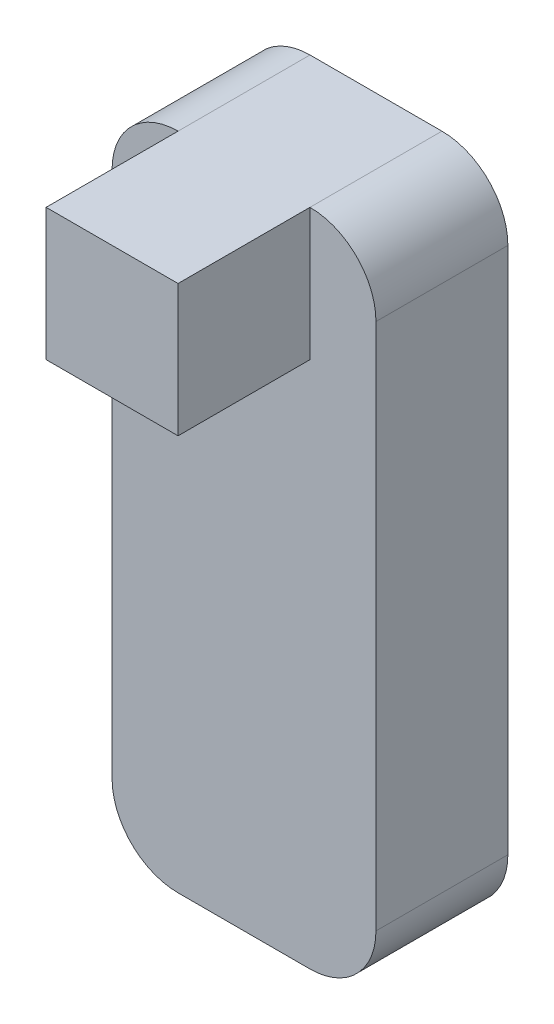
ISO-10303-21;
HEADER;
FILE_DESCRIPTION(('STEP AP214'),'2;1');
FILE_NAME('part.step','',(''),(''),'','','');
FILE_SCHEMA(('AUTOMOTIVE_DESIGN { 1 0 10303 214 1 1 1 1 }'));
ENDSEC;
DATA;
#1=APPLICATION_CONTEXT('core data for automotive mechanical design processes');
#2=APPLICATION_PROTOCOL_DEFINITION('international standard','automotive_design',2000,#1);
#3=PRODUCT_CONTEXT('',#1,'mechanical');
#4=PRODUCT('Part','Part','',(#3));
#5=PRODUCT_RELATED_PRODUCT_CATEGORY('part','',(#4));
#6=PRODUCT_DEFINITION_FORMATION('','',#4);
#7=PRODUCT_DEFINITION_CONTEXT('part definition',#1,'design');
#8=PRODUCT_DEFINITION('design','',#6,#7);
#9=PRODUCT_DEFINITION_SHAPE('','',#8);
#10=(LENGTH_UNIT() NAMED_UNIT(*) SI_UNIT(.MILLI.,.METRE.));
#11=(NAMED_UNIT(*) PLANE_ANGLE_UNIT() SI_UNIT($,.RADIAN.));
#12=(NAMED_UNIT(*) SI_UNIT($,.STERADIAN.) SOLID_ANGLE_UNIT());
#13=UNCERTAINTY_MEASURE_WITH_UNIT(LENGTH_MEASURE(1.E-05),#10,'distance_accuracy_value','');
#14=(GEOMETRIC_REPRESENTATION_CONTEXT(3) GLOBAL_UNCERTAINTY_ASSIGNED_CONTEXT((#13)) GLOBAL_UNIT_ASSIGNED_CONTEXT((#10,
#11,#12)) REPRESENTATION_CONTEXT('',''));
#15=CARTESIAN_POINT('',(0.,0.,0.));
#16=DIRECTION('',(0.,0.,1.));
#17=DIRECTION('',(1.,0.,0.));
#18=AXIS2_PLACEMENT_3D('',#15,#16,#17);
#19=CARTESIAN_POINT('',(30.,10.,20.));
#20=DIRECTION('',(0.,0.,-1.));
#21=DIRECTION('',(-1.,0.,0.));
#22=AXIS2_PLACEMENT_3D('',#19,#20,#21);
#23=CYLINDRICAL_SURFACE('',#22,10.);
#24=CARTESIAN_POINT('',(30.,10.,0.));
#25=DIRECTION('',(0.,0.,1.));
#26=DIRECTION('',(1.,0.,0.));
#27=AXIS2_PLACEMENT_3D('',#24,#25,#26);
#28=CIRCLE('',#27,10.);
#29=CARTESIAN_POINT('',(29.9999999999999,0.,0.));
#30=VERTEX_POINT('',#29);
#31=CARTESIAN_POINT('',(40.,10.0000000000001,0.));
#32=VERTEX_POINT('',#31);
#33=EDGE_CURVE('E153',#30,#32,#28,.T.);
#34=ORIENTED_EDGE('',*,*,#33,.T.);
#35=DIRECTION('',(0.,0.,-1.));
#36=VECTOR('',#35,1.);
#37=CARTESIAN_POINT('',(40.,10.0000000000001,20.));
#38=LINE('',#37,#36);
#39=CARTESIAN_POINT('',(40.,10.0000000000001,20.));
#40=VERTEX_POINT('',#39);
#41=EDGE_CURVE('E12',#40,#32,#38,.T.);
#42=ORIENTED_EDGE('',*,*,#41,.F.);
#43=CARTESIAN_POINT('',(30.,10.,20.));
#44=DIRECTION('',(0.,0.,1.));
#45=DIRECTION('',(1.,0.,0.));
#46=AXIS2_PLACEMENT_3D('',#43,#44,#45);
#47=CIRCLE('',#46,10.);
#48=CARTESIAN_POINT('',(29.9999999999999,0.,20.));
#49=VERTEX_POINT('',#48);
#50=EDGE_CURVE('E180',#49,#40,#47,.T.);
#51=ORIENTED_EDGE('',*,*,#50,.F.);
#52=DIRECTION('',(0.,0.,-1.));
#53=VECTOR('',#52,1.);
#54=CARTESIAN_POINT('',(29.9999999999999,0.,20.));
#55=LINE('',#54,#53);
#56=EDGE_CURVE('E149',#49,#30,#55,.T.);
#57=ORIENTED_EDGE('',*,*,#56,.T.);
#58=EDGE_LOOP('',(#34,#42,#51,#57));
#59=FACE_BOUND('',#58,.T.);
#60=ADVANCED_FACE('F42',(#59),#23,.T.);
#61=CARTESIAN_POINT('',(40.,0.,20.));
#62=DIRECTION('',(-1.,0.,0.));
#63=DIRECTION('',(0.,-1.,0.));
#64=AXIS2_PLACEMENT_3D('',#61,#62,#63);
#65=PLANE('',#64);
#66=DIRECTION('',(0.,1.,0.));
#67=VECTOR('',#66,1.);
#68=CARTESIAN_POINT('',(40.,0.,0.));
#69=LINE('',#68,#67);
#70=CARTESIAN_POINT('',(40.,90.,0.));
#71=VERTEX_POINT('',#70);
#72=EDGE_CURVE('E157',#32,#71,#69,.T.);
#73=ORIENTED_EDGE('',*,*,#72,.T.);
#74=DIRECTION('',(0.,0.,-1.));
#75=VECTOR('',#74,1.);
#76=CARTESIAN_POINT('',(40.,90.,20.));
#77=LINE('',#76,#75);
#78=CARTESIAN_POINT('',(40.,90.,20.));
#79=VERTEX_POINT('',#78);
#80=EDGE_CURVE('E50',#79,#71,#77,.T.);
#81=ORIENTED_EDGE('',*,*,#80,.F.);
#82=DIRECTION('',(0.,1.,0.));
#83=VECTOR('',#82,1.);
#84=CARTESIAN_POINT('',(40.,0.,20.));
#85=LINE('',#84,#83);
#86=EDGE_CURVE('E107',#40,#79,#85,.T.);
#87=ORIENTED_EDGE('',*,*,#86,.F.);
#88=ORIENTED_EDGE('',*,*,#41,.T.);
#89=EDGE_LOOP('',(#73,#81,#87,#88));
#90=FACE_BOUND('',#89,.T.);
#91=ADVANCED_FACE('F273',(#90),#65,.F.);
#92=CARTESIAN_POINT('',(30.,90.,20.));
#93=DIRECTION('',(0.,0.,-1.));
#94=DIRECTION('',(-1.,0.,0.));
#95=AXIS2_PLACEMENT_3D('',#92,#93,#94);
#96=CYLINDRICAL_SURFACE('',#95,9.99999999999999);
#97=CARTESIAN_POINT('',(30.,90.,0.));
#98=DIRECTION('',(0.,0.,1.));
#99=DIRECTION('',(1.,0.,0.));
#100=AXIS2_PLACEMENT_3D('',#97,#98,#99);
#101=CIRCLE('',#100,9.99999999999999);
#102=CARTESIAN_POINT('',(30.,100.,0.));
#103=VERTEX_POINT('',#102);
#104=EDGE_CURVE('E161',#71,#103,#101,.T.);
#105=ORIENTED_EDGE('',*,*,#104,.T.);
#106=DIRECTION('',(0.,0.,-1.));
#107=VECTOR('',#106,1.);
#108=CARTESIAN_POINT('',(30.,100.,20.));
#109=LINE('',#108,#107);
#110=CARTESIAN_POINT('',(30.,100.,20.));
#111=VERTEX_POINT('',#110);
#112=EDGE_CURVE('E190',#111,#103,#109,.T.);
#113=ORIENTED_EDGE('',*,*,#112,.F.);
#114=CARTESIAN_POINT('',(30.,90.,20.));
#115=DIRECTION('',(0.,0.,1.));
#116=DIRECTION('',(1.,0.,0.));
#117=AXIS2_PLACEMENT_3D('',#114,#115,#116);
#118=CIRCLE('',#117,9.99999999999999);
#119=EDGE_CURVE('E200',#79,#111,#118,.T.);
#120=ORIENTED_EDGE('',*,*,#119,.F.);
#121=ORIENTED_EDGE('',*,*,#80,.T.);
#122=EDGE_LOOP('',(#105,#113,#120,#121));
#123=FACE_BOUND('',#122,.T.);
#124=ADVANCED_FACE('F197',(#123),#96,.T.);
#125=CARTESIAN_POINT('',(0.,100.,20.));
#126=DIRECTION('',(0.,1.,0.));
#127=DIRECTION('',(0.,0.,1.));
#128=AXIS2_PLACEMENT_3D('',#125,#126,#127);
#129=PLANE('',#128);
#130=DIRECTION('',(1.,0.,0.));
#131=VECTOR('',#130,1.);
#132=CARTESIAN_POINT('',(0.,100.,0.));
#133=LINE('',#132,#131);
#134=CARTESIAN_POINT('',(10.,100.,0.));
#135=VERTEX_POINT('',#134);
#136=EDGE_CURVE('E165',#135,#103,#133,.T.);
#137=ORIENTED_EDGE('',*,*,#136,.F.);
#138=DIRECTION('',(0.,0.,-1.));
#139=VECTOR('',#138,1.);
#140=CARTESIAN_POINT('',(10.,100.,20.));
#141=LINE('',#140,#139);
#142=CARTESIAN_POINT('',(10.,100.,20.));
#143=VERTEX_POINT('',#142);
#144=EDGE_CURVE('E187',#143,#135,#141,.T.);
#145=ORIENTED_EDGE('',*,*,#144,.F.);
#146=DIRECTION('',(0.,0.,1.));
#147=VECTOR('',#146,1.);
#148=CARTESIAN_POINT('',(10.,100.,20.));
#149=LINE('',#148,#147);
#150=CARTESIAN_POINT('',(10.0000000000001,100.,40.));
#151=VERTEX_POINT('',#150);
#152=EDGE_CURVE('E349',#143,#151,#149,.T.);
#153=ORIENTED_EDGE('',*,*,#152,.T.);
#154=DIRECTION('',(1.,0.,0.));
#155=VECTOR('',#154,1.);
#156=CARTESIAN_POINT('',(30.0000000000001,100.,40.));
#157=LINE('',#156,#155);
#158=CARTESIAN_POINT('',(30.0000000000001,100.,40.));
#159=VERTEX_POINT('',#158);
#160=EDGE_CURVE('E332',#151,#159,#157,.T.);
#161=ORIENTED_EDGE('',*,*,#160,.T.);
#162=DIRECTION('',(0.,0.,-1.));
#163=VECTOR('',#162,1.);
#164=CARTESIAN_POINT('',(30.,100.,20.));
#165=LINE('',#164,#163);
#166=EDGE_CURVE('E214',#159,#111,#165,.T.);
#167=ORIENTED_EDGE('',*,*,#166,.T.);
#168=ORIENTED_EDGE('',*,*,#112,.T.);
#169=EDGE_LOOP('',(#137,#145,#153,#161,#167,#168));
#170=FACE_BOUND('',#169,.T.);
#171=ADVANCED_FACE('F208',(#170),#129,.T.);
#172=CARTESIAN_POINT('',(10.,90.,20.));
#173=DIRECTION('',(0.,0.,-1.));
#174=DIRECTION('',(-1.,0.,0.));
#175=AXIS2_PLACEMENT_3D('',#172,#173,#174);
#176=CYLINDRICAL_SURFACE('',#175,9.99999999999999);
#177=CARTESIAN_POINT('',(10.,90.,0.));
#178=DIRECTION('',(0.,0.,1.));
#179=DIRECTION('',(1.,0.,0.));
#180=AXIS2_PLACEMENT_3D('',#177,#178,#179);
#181=CIRCLE('',#180,9.99999999999999);
#182=CARTESIAN_POINT('',(0.,90.,0.));
#183=VERTEX_POINT('',#182);
#184=EDGE_CURVE('E169',#135,#183,#181,.T.);
#185=ORIENTED_EDGE('',*,*,#184,.T.);
#186=DIRECTION('',(0.,0.,-1.));
#187=VECTOR('',#186,1.);
#188=CARTESIAN_POINT('',(0.,90.,20.));
#189=LINE('',#188,#187);
#190=CARTESIAN_POINT('',(0.,90.,20.));
#191=VERTEX_POINT('',#190);
#192=EDGE_CURVE('E133',#191,#183,#189,.T.);
#193=ORIENTED_EDGE('',*,*,#192,.F.);
#194=CARTESIAN_POINT('',(10.,90.,20.));
#195=DIRECTION('',(0.,0.,1.));
#196=DIRECTION('',(1.,0.,0.));
#197=AXIS2_PLACEMENT_3D('',#194,#195,#196);
#198=CIRCLE('',#197,9.99999999999999);
#199=EDGE_CURVE('E141',#143,#191,#198,.T.);
#200=ORIENTED_EDGE('',*,*,#199,.F.);
#201=ORIENTED_EDGE('',*,*,#144,.T.);
#202=EDGE_LOOP('',(#185,#193,#200,#201));
#203=FACE_BOUND('',#202,.T.);
#204=ADVANCED_FACE('F283',(#203),#176,.T.);
#205=CARTESIAN_POINT('',(0.,0.,20.));
#206=DIRECTION('',(-1.,0.,0.));
#207=DIRECTION('',(0.,0.,1.));
#208=AXIS2_PLACEMENT_3D('',#205,#206,#207);
#209=PLANE('',#208);
#210=DIRECTION('',(0.,1.,0.));
#211=VECTOR('',#210,1.);
#212=CARTESIAN_POINT('',(0.,0.,0.));
#213=LINE('',#212,#211);
#214=CARTESIAN_POINT('',(0.,10.0000000000001,0.));
#215=VERTEX_POINT('',#214);
#216=EDGE_CURVE('E127',#215,#183,#213,.T.);
#217=ORIENTED_EDGE('',*,*,#216,.F.);
#218=DIRECTION('',(0.,0.,-1.));
#219=VECTOR('',#218,1.);
#220=CARTESIAN_POINT('',(0.,10.0000000000001,20.));
#221=LINE('',#220,#219);
#222=CARTESIAN_POINT('',(0.,10.0000000000001,20.));
#223=VERTEX_POINT('',#222);
#224=EDGE_CURVE('E122',#223,#215,#221,.T.);
#225=ORIENTED_EDGE('',*,*,#224,.F.);
#226=DIRECTION('',(0.,1.,0.));
#227=VECTOR('',#226,1.);
#228=CARTESIAN_POINT('',(0.,0.,20.));
#229=LINE('',#228,#227);
#230=EDGE_CURVE('E125',#223,#191,#229,.T.);
#231=ORIENTED_EDGE('',*,*,#230,.T.);
#232=ORIENTED_EDGE('',*,*,#192,.T.);
#233=EDGE_LOOP('',(#217,#225,#231,#232));
#234=FACE_BOUND('',#233,.T.);
#235=ADVANCED_FACE('F124',(#234),#209,.T.);
#236=CARTESIAN_POINT('',(10.,10.,20.));
#237=DIRECTION('',(0.,0.,-1.));
#238=DIRECTION('',(-1.,0.,0.));
#239=AXIS2_PLACEMENT_3D('',#236,#237,#238);
#240=CYLINDRICAL_SURFACE('',#239,10.);
#241=CARTESIAN_POINT('',(10.,10.,0.));
#242=DIRECTION('',(0.,0.,1.));
#243=DIRECTION('',(1.,0.,0.));
#244=AXIS2_PLACEMENT_3D('',#241,#242,#243);
#245=CIRCLE('',#244,10.);
#246=CARTESIAN_POINT('',(10.0000000000001,0.,0.));
#247=VERTEX_POINT('',#246);
#248=EDGE_CURVE('E175',#247,#215,#245,.F.);
#249=ORIENTED_EDGE('',*,*,#248,.F.);
#250=DIRECTION('',(0.,0.,-1.));
#251=VECTOR('',#250,1.);
#252=CARTESIAN_POINT('',(10.0000000000001,0.,20.));
#253=LINE('',#252,#251);
#254=CARTESIAN_POINT('',(10.0000000000001,0.,20.));
#255=VERTEX_POINT('',#254);
#256=EDGE_CURVE('E134',#255,#247,#253,.T.);
#257=ORIENTED_EDGE('',*,*,#256,.F.);
#258=CARTESIAN_POINT('',(10.,10.,20.));
#259=DIRECTION('',(0.,0.,1.));
#260=DIRECTION('',(1.,0.,0.));
#261=AXIS2_PLACEMENT_3D('',#258,#259,#260);
#262=CIRCLE('',#261,10.);
#263=EDGE_CURVE('E138',#255,#223,#262,.F.);
#264=ORIENTED_EDGE('',*,*,#263,.T.);
#265=ORIENTED_EDGE('',*,*,#224,.T.);
#266=EDGE_LOOP('',(#249,#257,#264,#265));
#267=FACE_BOUND('',#266,.T.);
#268=ADVANCED_FACE('F145',(#267),#240,.T.);
#269=CARTESIAN_POINT('',(0.,0.,20.));
#270=DIRECTION('',(0.,1.,0.));
#271=DIRECTION('',(0.,0.,1.));
#272=AXIS2_PLACEMENT_3D('',#269,#270,#271);
#273=PLANE('',#272);
#274=DIRECTION('',(1.,0.,0.));
#275=VECTOR('',#274,1.);
#276=CARTESIAN_POINT('',(0.,0.,0.));
#277=LINE('',#276,#275);
#278=EDGE_CURVE('E99',#247,#30,#277,.T.);
#279=ORIENTED_EDGE('',*,*,#278,.T.);
#280=ORIENTED_EDGE('',*,*,#56,.F.);
#281=DIRECTION('',(1.,0.,0.));
#282=VECTOR('',#281,1.);
#283=CARTESIAN_POINT('',(0.,0.,20.));
#284=LINE('',#283,#282);
#285=EDGE_CURVE('E66',#255,#49,#284,.T.);
#286=ORIENTED_EDGE('',*,*,#285,.F.);
#287=ORIENTED_EDGE('',*,*,#256,.T.);
#288=EDGE_LOOP('',(#279,#280,#286,#287));
#289=FACE_BOUND('',#288,.T.);
#290=ADVANCED_FACE('F291',(#289),#273,.F.);
#291=CARTESIAN_POINT('',(0.,0.,20.));
#292=DIRECTION('',(0.,0.,1.));
#293=DIRECTION('',(1.,0.,0.));
#294=AXIS2_PLACEMENT_3D('',#291,#292,#293);
#295=PLANE('',#294);
#296=DIRECTION('',(0.,1.,0.));
#297=VECTOR('',#296,1.);
#298=CARTESIAN_POINT('',(30.0000000000001,80.,20.));
#299=LINE('',#298,#297);
#300=CARTESIAN_POINT('',(30.0000000000001,80.,20.));
#301=VERTEX_POINT('',#300);
#302=EDGE_CURVE('E220',#301,#111,#299,.T.);
#303=ORIENTED_EDGE('',*,*,#302,.F.);
#304=DIRECTION('',(-1.,0.,0.));
#305=VECTOR('',#304,1.);
#306=CARTESIAN_POINT('',(30.0000000000001,80.,20.));
#307=LINE('',#306,#305);
#308=CARTESIAN_POINT('',(10.0000000000001,80.,20.));
#309=VERTEX_POINT('',#308);
#310=EDGE_CURVE('E329',#301,#309,#307,.T.);
#311=ORIENTED_EDGE('',*,*,#310,.T.);
#312=DIRECTION('',(0.,1.,0.));
#313=VECTOR('',#312,1.);
#314=CARTESIAN_POINT('',(10.0000000000001,80.,20.));
#315=LINE('',#314,#313);
#316=EDGE_CURVE('E343',#309,#143,#315,.T.);
#317=ORIENTED_EDGE('',*,*,#316,.T.);
#318=ORIENTED_EDGE('',*,*,#199,.T.);
#319=ORIENTED_EDGE('',*,*,#230,.F.);
#320=ORIENTED_EDGE('',*,*,#263,.F.);
#321=ORIENTED_EDGE('',*,*,#285,.T.);
#322=ORIENTED_EDGE('',*,*,#50,.T.);
#323=ORIENTED_EDGE('',*,*,#86,.T.);
#324=ORIENTED_EDGE('',*,*,#119,.T.);
#325=EDGE_LOOP('',(#303,#311,#317,#318,#319,#320,#321,#322,#323,#324));
#326=FACE_BOUND('',#325,.T.);
#327=ADVANCED_FACE('F137',(#326),#295,.T.);
#328=CARTESIAN_POINT('',(0.,0.,0.));
#329=DIRECTION('',(0.,0.,1.));
#330=DIRECTION('',(1.,0.,0.));
#331=AXIS2_PLACEMENT_3D('',#328,#329,#330);
#332=PLANE('',#331);
#333=CARTESIAN_POINT('',(20.,10.0000000000001,0.));
#334=DIRECTION('',(0.,0.,-1.));
#335=DIRECTION('',(-1.,0.,0.));
#336=AXIS2_PLACEMENT_3D('',#333,#334,#335);
#337=CIRCLE('',#336,2.5);
#338=CARTESIAN_POINT('',(18.,8.50000000000007,0.));
#339=VERTEX_POINT('',#338);
#340=CARTESIAN_POINT('',(22.,8.50000000000007,0.));
#341=VERTEX_POINT('',#340);
#342=EDGE_CURVE('E241',#339,#341,#337,.T.);
#343=ORIENTED_EDGE('',*,*,#342,.F.);
#344=DIRECTION('',(-1.,0.,0.));
#345=VECTOR('',#344,1.);
#346=CARTESIAN_POINT('',(0.,8.50000000000007,0.));
#347=LINE('',#346,#345);
#348=EDGE_CURVE('E57',#341,#339,#347,.T.);
#349=ORIENTED_EDGE('',*,*,#348,.F.);
#350=EDGE_LOOP('',(#343,#349));
#351=FACE_BOUND('',#350,.T.);
#352=ORIENTED_EDGE('',*,*,#33,.F.);
#353=ORIENTED_EDGE('',*,*,#278,.F.);
#354=ORIENTED_EDGE('',*,*,#248,.T.);
#355=ORIENTED_EDGE('',*,*,#216,.T.);
#356=ORIENTED_EDGE('',*,*,#184,.F.);
#357=ORIENTED_EDGE('',*,*,#136,.T.);
#358=ORIENTED_EDGE('',*,*,#104,.F.);
#359=ORIENTED_EDGE('',*,*,#72,.F.);
#360=EDGE_LOOP('',(#352,#353,#354,#355,#356,#357,#358,#359));
#361=FACE_BOUND('',#360,.T.);
#362=ADVANCED_FACE('F203',(#351,#361),#332,.F.);
#363=CARTESIAN_POINT('',(0.,8.50000000000007,8.));
#364=DIRECTION('',(0.,-1.,0.));
#365=DIRECTION('',(0.,0.,-1.));
#366=AXIS2_PLACEMENT_3D('',#363,#364,#365);
#367=PLANE('',#366);
#368=ORIENTED_EDGE('',*,*,#348,.T.);
#369=DIRECTION('',(0.,0.,-1.));
#370=VECTOR('',#369,1.);
#371=CARTESIAN_POINT('',(18.,8.50000000000007,8.));
#372=LINE('',#371,#370);
#373=CARTESIAN_POINT('',(18.,8.50000000000007,8.));
#374=VERTEX_POINT('',#373);
#375=EDGE_CURVE('E243',#374,#339,#372,.T.);
#376=ORIENTED_EDGE('',*,*,#375,.F.);
#377=DIRECTION('',(-1.,0.,0.));
#378=VECTOR('',#377,1.);
#379=CARTESIAN_POINT('',(0.,8.50000000000007,8.));
#380=LINE('',#379,#378);
#381=CARTESIAN_POINT('',(22.,8.50000000000007,8.));
#382=VERTEX_POINT('',#381);
#383=EDGE_CURVE('E246',#382,#374,#380,.T.);
#384=ORIENTED_EDGE('',*,*,#383,.F.);
#385=DIRECTION('',(0.,0.,-1.));
#386=VECTOR('',#385,1.);
#387=CARTESIAN_POINT('',(22.,8.50000000000007,8.));
#388=LINE('',#387,#386);
#389=EDGE_CURVE('E158',#382,#341,#388,.T.);
#390=ORIENTED_EDGE('',*,*,#389,.T.);
#391=EDGE_LOOP('',(#368,#376,#384,#390));
#392=FACE_BOUND('',#391,.T.);
#393=ADVANCED_FACE('F247',(#392),#367,.F.);
#394=CARTESIAN_POINT('',(20.,10.0000000000001,8.));
#395=DIRECTION('',(0.,0.,-1.));
#396=DIRECTION('',(-1.,0.,0.));
#397=AXIS2_PLACEMENT_3D('',#394,#395,#396);
#398=CYLINDRICAL_SURFACE('',#397,2.5);
#399=ORIENTED_EDGE('',*,*,#342,.T.);
#400=ORIENTED_EDGE('',*,*,#389,.F.);
#401=CARTESIAN_POINT('',(20.,10.0000000000001,8.));
#402=DIRECTION('',(0.,0.,-1.));
#403=DIRECTION('',(-1.,0.,0.));
#404=AXIS2_PLACEMENT_3D('',#401,#402,#403);
#405=CIRCLE('',#404,2.5);
#406=EDGE_CURVE('E239',#374,#382,#405,.T.);
#407=ORIENTED_EDGE('',*,*,#406,.F.);
#408=ORIENTED_EDGE('',*,*,#375,.T.);
#409=EDGE_LOOP('',(#399,#400,#407,#408));
#410=FACE_BOUND('',#409,.T.);
#411=ADVANCED_FACE('F237',(#410),#398,.F.);
#412=CARTESIAN_POINT('',(0.,0.,8.));
#413=DIRECTION('',(0.,0.,-1.));
#414=DIRECTION('',(-1.,0.,0.));
#415=AXIS2_PLACEMENT_3D('',#412,#413,#414);
#416=PLANE('',#415);
#417=ORIENTED_EDGE('',*,*,#383,.T.);
#418=ORIENTED_EDGE('',*,*,#406,.T.);
#419=EDGE_LOOP('',(#417,#418));
#420=FACE_BOUND('',#419,.T.);
#421=ADVANCED_FACE('F251',(#420),#416,.T.);
#422=CARTESIAN_POINT('',(30.0000000000001,80.,20.));
#423=DIRECTION('',(1.,0.,0.));
#424=DIRECTION('',(0.,1.,0.));
#425=AXIS2_PLACEMENT_3D('',#422,#423,#424);
#426=PLANE('',#425);
#427=ORIENTED_EDGE('',*,*,#166,.F.);
#428=DIRECTION('',(0.,1.,0.));
#429=VECTOR('',#428,1.);
#430=CARTESIAN_POINT('',(30.0000000000001,80.,40.));
#431=LINE('',#430,#429);
#432=CARTESIAN_POINT('',(30.0000000000001,80.,40.));
#433=VERTEX_POINT('',#432);
#434=EDGE_CURVE('E260',#433,#159,#431,.T.);
#435=ORIENTED_EDGE('',*,*,#434,.F.);
#436=DIRECTION('',(0.,0.,-1.));
#437=VECTOR('',#436,1.);
#438=CARTESIAN_POINT('',(30.0000000000001,80.,20.));
#439=LINE('',#438,#437);
#440=EDGE_CURVE('E324',#433,#301,#439,.T.);
#441=ORIENTED_EDGE('',*,*,#440,.T.);
#442=ORIENTED_EDGE('',*,*,#302,.T.);
#443=EDGE_LOOP('',(#427,#435,#441,#442));
#444=FACE_BOUND('',#443,.T.);
#445=ADVANCED_FACE('F305',(#444),#426,.T.);
#446=CARTESIAN_POINT('',(30.0000000000001,80.,40.));
#447=DIRECTION('',(0.,0.,1.));
#448=DIRECTION('',(1.,0.,0.));
#449=AXIS2_PLACEMENT_3D('',#446,#447,#448);
#450=PLANE('',#449);
#451=ORIENTED_EDGE('',*,*,#160,.F.);
#452=DIRECTION('',(0.,1.,0.));
#453=VECTOR('',#452,1.);
#454=CARTESIAN_POINT('',(10.0000000000001,80.,40.));
#455=LINE('',#454,#453);
#456=CARTESIAN_POINT('',(10.0000000000001,80.,40.));
#457=VERTEX_POINT('',#456);
#458=EDGE_CURVE('E336',#457,#151,#455,.T.);
#459=ORIENTED_EDGE('',*,*,#458,.F.);
#460=DIRECTION('',(1.,0.,0.));
#461=VECTOR('',#460,1.);
#462=CARTESIAN_POINT('',(30.0000000000001,80.,40.));
#463=LINE('',#462,#461);
#464=EDGE_CURVE('E328',#457,#433,#463,.T.);
#465=ORIENTED_EDGE('',*,*,#464,.T.);
#466=ORIENTED_EDGE('',*,*,#434,.T.);
#467=EDGE_LOOP('',(#451,#459,#465,#466));
#468=FACE_BOUND('',#467,.T.);
#469=ADVANCED_FACE('F308',(#468),#450,.T.);
#470=CARTESIAN_POINT('',(10.0000000000001,80.,20.));
#471=DIRECTION('',(-1.,0.,0.));
#472=DIRECTION('',(0.,-1.,0.));
#473=AXIS2_PLACEMENT_3D('',#470,#471,#472);
#474=PLANE('',#473);
#475=ORIENTED_EDGE('',*,*,#152,.F.);
#476=ORIENTED_EDGE('',*,*,#316,.F.);
#477=DIRECTION('',(0.,0.,1.));
#478=VECTOR('',#477,1.);
#479=CARTESIAN_POINT('',(10.0000000000001,80.,20.));
#480=LINE('',#479,#478);
#481=EDGE_CURVE('E339',#309,#457,#480,.T.);
#482=ORIENTED_EDGE('',*,*,#481,.T.);
#483=ORIENTED_EDGE('',*,*,#458,.T.);
#484=EDGE_LOOP('',(#475,#476,#482,#483));
#485=FACE_BOUND('',#484,.T.);
#486=ADVANCED_FACE('F309',(#485),#474,.T.);
#487=CARTESIAN_POINT('',(0.,80.,0.));
#488=DIRECTION('',(0.,-1.,0.));
#489=DIRECTION('',(1.,0.,0.));
#490=AXIS2_PLACEMENT_3D('',#487,#488,#489);
#491=PLANE('',#490);
#492=ORIENTED_EDGE('',*,*,#440,.F.);
#493=ORIENTED_EDGE('',*,*,#464,.F.);
#494=ORIENTED_EDGE('',*,*,#481,.F.);
#495=ORIENTED_EDGE('',*,*,#310,.F.);
#496=EDGE_LOOP('',(#492,#493,#494,#495));
#497=FACE_BOUND('',#496,.T.);
#498=ADVANCED_FACE('F312',(#497),#491,.T.);
#499=CLOSED_SHELL('',(#60,#91,#124,#171,#204,#235,#268,#290,#327,#362,#393,#411,#421,#445,#469,
#486,#498));
#500=MANIFOLD_SOLID_BREP('B2',#499);
#501=ADVANCED_BREP_SHAPE_REPRESENTATION('',(#18,#500),#14);
#502=SHAPE_DEFINITION_REPRESENTATION(#9,#501);
ENDSEC;
END-ISO-10303-21;
